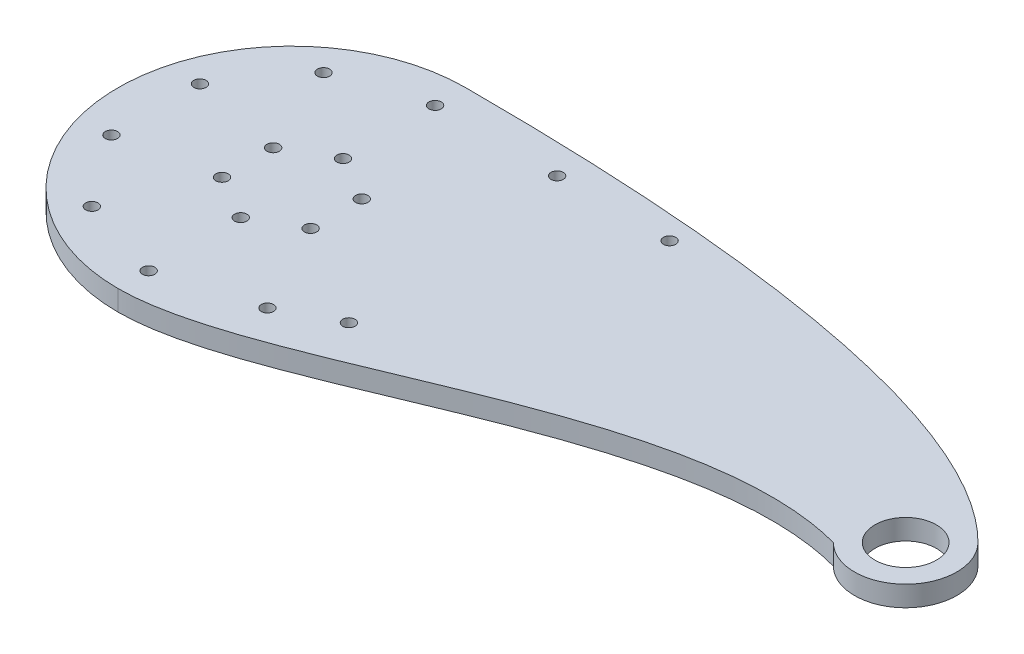
ISO-10303-21;
HEADER;
FILE_DESCRIPTION(('STEP AP214'),'2;1');
FILE_NAME('part.step','',(''),(''),'','','');
FILE_SCHEMA(('AUTOMOTIVE_DESIGN { 1 0 10303 214 1 1 1 1 }'));
ENDSEC;
DATA;
#1=APPLICATION_CONTEXT('core data for automotive mechanical design processes');
#2=APPLICATION_PROTOCOL_DEFINITION('international standard','automotive_design',2000,#1);
#3=PRODUCT_CONTEXT('',#1,'mechanical');
#4=PRODUCT('Part','Part','',(#3));
#5=PRODUCT_RELATED_PRODUCT_CATEGORY('part','',(#4));
#6=PRODUCT_DEFINITION_FORMATION('','',#4);
#7=PRODUCT_DEFINITION_CONTEXT('part definition',#1,'design');
#8=PRODUCT_DEFINITION('design','',#6,#7);
#9=PRODUCT_DEFINITION_SHAPE('','',#8);
#10=(LENGTH_UNIT() NAMED_UNIT(*) SI_UNIT(.MILLI.,.METRE.));
#11=(NAMED_UNIT(*) PLANE_ANGLE_UNIT() SI_UNIT($,.RADIAN.));
#12=(NAMED_UNIT(*) SI_UNIT($,.STERADIAN.) SOLID_ANGLE_UNIT());
#13=UNCERTAINTY_MEASURE_WITH_UNIT(LENGTH_MEASURE(1.E-05),#10,'distance_accuracy_value','');
#14=(GEOMETRIC_REPRESENTATION_CONTEXT(3) GLOBAL_UNCERTAINTY_ASSIGNED_CONTEXT((#13)) GLOBAL_UNIT_ASSIGNED_CONTEXT((#10,
#11,#12)) REPRESENTATION_CONTEXT('',''));
#15=CARTESIAN_POINT('',(0.,0.,0.));
#16=DIRECTION('',(0.,0.,1.));
#17=DIRECTION('',(1.,0.,0.));
#18=AXIS2_PLACEMENT_3D('',#15,#16,#17);
#19=CARTESIAN_POINT('',(0.,5.,0.));
#20=DIRECTION('',(0.,-1.,0.));
#21=DIRECTION('',(0.,0.,-1.));
#22=AXIS2_PLACEMENT_3D('',#19,#20,#21);
#23=CYLINDRICAL_SURFACE('',#22,42.5);
#24=CARTESIAN_POINT('',(0.,0.,0.));
#25=DIRECTION('',(0.,1.,0.));
#26=DIRECTION('',(0.,0.,1.));
#27=AXIS2_PLACEMENT_3D('',#24,#25,#26);
#28=CIRCLE('',#27,42.5);
#29=CARTESIAN_POINT('',(0.,0.,-42.5));
#30=VERTEX_POINT('',#29);
#31=CARTESIAN_POINT('',(0.,0.,42.5));
#32=VERTEX_POINT('',#31);
#33=EDGE_CURVE('E129',#30,#32,#28,.T.);
#34=ORIENTED_EDGE('',*,*,#33,.T.);
#35=DIRECTION('',(0.,-1.,0.));
#36=VECTOR('',#35,1.);
#37=CARTESIAN_POINT('',(0.,5.,42.5));
#38=LINE('',#37,#36);
#39=CARTESIAN_POINT('',(0.,5.,42.5));
#40=VERTEX_POINT('',#39);
#41=EDGE_CURVE('E11',#40,#32,#38,.T.);
#42=ORIENTED_EDGE('',*,*,#41,.F.);
#43=CARTESIAN_POINT('',(0.,5.,0.));
#44=DIRECTION('',(0.,1.,0.));
#45=DIRECTION('',(0.,0.,1.));
#46=AXIS2_PLACEMENT_3D('',#43,#44,#45);
#47=CIRCLE('',#46,42.5);
#48=CARTESIAN_POINT('',(0.,5.,-42.5));
#49=VERTEX_POINT('',#48);
#50=EDGE_CURVE('E89',#49,#40,#47,.T.);
#51=ORIENTED_EDGE('',*,*,#50,.F.);
#52=DIRECTION('',(0.,-1.,0.));
#53=VECTOR('',#52,1.);
#54=CARTESIAN_POINT('',(0.,5.,-42.5));
#55=LINE('',#54,#53);
#56=EDGE_CURVE('E55',#49,#30,#55,.T.);
#57=ORIENTED_EDGE('',*,*,#56,.T.);
#58=EDGE_LOOP('',(#34,#42,#51,#57));
#59=FACE_BOUND('',#58,.T.);
#60=ADVANCED_FACE('F37',(#59),#23,.T.);
#61=CARTESIAN_POINT('',(0.,5.,42.5));
#62=CARTESIAN_POINT('',(35.2879098348382,5.,42.5));
#63=CARTESIAN_POINT('',(94.2965735894884,5.,-3.71849472024249));
#64=CARTESIAN_POINT('',(141.161165235168,5.,8.83883476483181));
#65=B_SPLINE_CURVE_WITH_KNOTS('',3,(#61,#62,#63,#64),.UNSPECIFIED.,.F.,.F.,(4,4),(0.,1.),.UNSPECIFIED.);
#66=DIRECTION('',(0.,-1.,0.));
#67=VECTOR('',#66,1.);
#68=SURFACE_OF_LINEAR_EXTRUSION('',#65,#67);
#69=CARTESIAN_POINT('',(0.,0.,42.5));
#70=CARTESIAN_POINT('',(35.2879098348382,0.,42.5));
#71=CARTESIAN_POINT('',(94.2965735894884,0.,-3.71849472024249));
#72=CARTESIAN_POINT('',(141.161165235168,0.,8.83883476483181));
#73=B_SPLINE_CURVE_WITH_KNOTS('',3,(#69,#70,#71,#72),.UNSPECIFIED.,.F.,.F.,(4,4),(0.,1.),.UNSPECIFIED.);
#74=CARTESIAN_POINT('',(141.161165235168,0.,8.83883476483184));
#75=VERTEX_POINT('',#74);
#76=EDGE_CURVE('E94',#32,#75,#73,.T.);
#77=ORIENTED_EDGE('',*,*,#76,.T.);
#78=DIRECTION('',(0.,-1.,0.));
#79=VECTOR('',#78,1.);
#80=CARTESIAN_POINT('',(141.161165235168,5.,8.83883476483184));
#81=LINE('',#80,#79);
#82=CARTESIAN_POINT('',(141.161165235168,5.,8.83883476483184));
#83=VERTEX_POINT('',#82);
#84=EDGE_CURVE('E46',#83,#75,#81,.T.);
#85=ORIENTED_EDGE('',*,*,#84,.F.);
#86=EDGE_CURVE('E81',#40,#83,#65,.T.);
#87=ORIENTED_EDGE('',*,*,#86,.F.);
#88=ORIENTED_EDGE('',*,*,#41,.T.);
#89=EDGE_LOOP('',(#77,#85,#87,#88));
#90=FACE_BOUND('',#89,.T.);
#91=ADVANCED_FACE('F93',(#90),#68,.F.);
#92=CARTESIAN_POINT('',(150.,5.,0.));
#93=DIRECTION('',(0.,-1.,0.));
#94=DIRECTION('',(0.,0.,-1.));
#95=AXIS2_PLACEMENT_3D('',#92,#93,#94);
#96=CYLINDRICAL_SURFACE('',#95,12.5);
#97=CARTESIAN_POINT('',(150.,0.,0.));
#98=DIRECTION('',(0.,1.,0.));
#99=DIRECTION('',(0.,0.,1.));
#100=AXIS2_PLACEMENT_3D('',#97,#98,#99);
#101=CIRCLE('',#100,12.5);
#102=CARTESIAN_POINT('',(158.838834764832,0.,-8.83883476483186));
#103=VERTEX_POINT('',#102);
#104=EDGE_CURVE('E133',#75,#103,#101,.T.);
#105=ORIENTED_EDGE('',*,*,#104,.T.);
#106=DIRECTION('',(0.,-1.,0.));
#107=VECTOR('',#106,1.);
#108=CARTESIAN_POINT('',(158.838834764832,5.,-8.83883476483186));
#109=LINE('',#108,#107);
#110=CARTESIAN_POINT('',(158.838834764832,5.,-8.83883476483186));
#111=VERTEX_POINT('',#110);
#112=EDGE_CURVE('E70',#111,#103,#109,.T.);
#113=ORIENTED_EDGE('',*,*,#112,.F.);
#114=CARTESIAN_POINT('',(150.,5.,0.));
#115=DIRECTION('',(0.,1.,0.));
#116=DIRECTION('',(0.,0.,1.));
#117=AXIS2_PLACEMENT_3D('',#114,#115,#116);
#118=CIRCLE('',#117,12.5);
#119=EDGE_CURVE('E88',#83,#111,#118,.T.);
#120=ORIENTED_EDGE('',*,*,#119,.F.);
#121=ORIENTED_EDGE('',*,*,#84,.T.);
#122=EDGE_LOOP('',(#105,#113,#120,#121));
#123=FACE_BOUND('',#122,.T.);
#124=ADVANCED_FACE('F98',(#123),#96,.T.);
#125=CARTESIAN_POINT('',(0.,5.,-42.5));
#126=CARTESIAN_POINT('',(43.8603574156955,5.,-42.5000000000001));
#127=CARTESIAN_POINT('',(128.226009793748,5.,-39.4516597359159));
#128=CARTESIAN_POINT('',(158.838834764832,5.,-8.83883476483186));
#129=B_SPLINE_CURVE_WITH_KNOTS('',3,(#125,#126,#127,#128),.UNSPECIFIED.,.F.,.F.,(4,4),(0.,1.),.UNSPECIFIED.);
#130=DIRECTION('',(0.,-1.,0.));
#131=VECTOR('',#130,1.);
#132=SURFACE_OF_LINEAR_EXTRUSION('',#129,#131);
#133=CARTESIAN_POINT('',(0.,0.,-42.5));
#134=CARTESIAN_POINT('',(43.8603574156955,0.,-42.5000000000001));
#135=CARTESIAN_POINT('',(128.226009793748,0.,-39.4516597359159));
#136=CARTESIAN_POINT('',(158.838834764832,0.,-8.83883476483186));
#137=B_SPLINE_CURVE_WITH_KNOTS('',3,(#133,#134,#135,#136),.UNSPECIFIED.,.F.,.F.,(4,4),(0.,1.),.UNSPECIFIED.);
#138=EDGE_CURVE('E145',#30,#103,#137,.T.);
#139=ORIENTED_EDGE('',*,*,#138,.F.);
#140=ORIENTED_EDGE('',*,*,#56,.F.);
#141=EDGE_CURVE('E99',#49,#111,#129,.T.);
#142=ORIENTED_EDGE('',*,*,#141,.T.);
#143=ORIENTED_EDGE('',*,*,#112,.T.);
#144=EDGE_LOOP('',(#139,#140,#142,#143));
#145=FACE_BOUND('',#144,.T.);
#146=ADVANCED_FACE('F116',(#145),#132,.T.);
#147=CARTESIAN_POINT('',(150.,5.,0.));
#148=DIRECTION('',(0.,-1.,0.));
#149=DIRECTION('',(0.,0.,-1.));
#150=AXIS2_PLACEMENT_3D('',#147,#148,#149);
#151=CYLINDRICAL_SURFACE('',#150,7.50000000000001);
#152=CARTESIAN_POINT('',(150.,5.,0.));
#153=DIRECTION('',(0.,1.,0.));
#154=DIRECTION('',(0.,0.,1.));
#155=AXIS2_PLACEMENT_3D('',#152,#153,#154);
#156=CIRCLE('',#155,7.50000000000001);
#157=CARTESIAN_POINT('',(150.,5.,7.50000000000001));
#158=VERTEX_POINT('',#157);
#159=EDGE_CURVE('E101',#158,#158,#156,.T.);
#160=ORIENTED_EDGE('',*,*,#159,.T.);
#161=EDGE_LOOP('',(#160));
#162=FACE_BOUND('',#161,.T.);
#163=CARTESIAN_POINT('',(150.,0.,0.));
#164=DIRECTION('',(0.,1.,0.));
#165=DIRECTION('',(0.,0.,1.));
#166=AXIS2_PLACEMENT_3D('',#163,#164,#165);
#167=CIRCLE('',#166,7.50000000000001);
#168=CARTESIAN_POINT('',(150.,0.,7.50000000000001));
#169=VERTEX_POINT('',#168);
#170=EDGE_CURVE('E149',#169,#169,#167,.T.);
#171=ORIENTED_EDGE('',*,*,#170,.F.);
#172=EDGE_LOOP('',(#171));
#173=FACE_BOUND('',#172,.T.);
#174=ADVANCED_FACE('F120',(#162,#173),#151,.F.);
#175=CARTESIAN_POINT('',(0.,5.,0.));
#176=DIRECTION('',(0.,1.,0.));
#177=DIRECTION('',(0.,0.,1.));
#178=AXIS2_PLACEMENT_3D('',#175,#176,#177);
#179=PLANE('',#178);
#180=CARTESIAN_POINT('',(35.461413578459,5.,21.5303491163372));
#181=DIRECTION('',(0.,1.,0.));
#182=DIRECTION('',(0.,0.,1.));
#183=AXIS2_PLACEMENT_3D('',#180,#181,#182);
#184=CIRCLE('',#183,1.5);
#185=CARTESIAN_POINT('',(35.461413578459,5.,23.0303491163372));
#186=VERTEX_POINT('',#185);
#187=EDGE_CURVE('E199',#186,#186,#184,.T.);
#188=ORIENTED_EDGE('',*,*,#187,.F.);
#189=EDGE_LOOP('',(#188));
#190=FACE_BOUND('',#189,.T.);
#191=CARTESIAN_POINT('',(22.3920433471983,5.,28.360493420162));
#192=DIRECTION('',(0.,1.,0.));
#193=DIRECTION('',(0.,0.,1.));
#194=AXIS2_PLACEMENT_3D('',#191,#192,#193);
#195=CIRCLE('',#194,1.5);
#196=CARTESIAN_POINT('',(22.3920433471983,5.,29.860493420162));
#197=VERTEX_POINT('',#196);
#198=EDGE_CURVE('E205',#197,#197,#195,.T.);
#199=ORIENTED_EDGE('',*,*,#198,.F.);
#200=EDGE_LOOP('',(#199));
#201=FACE_BOUND('',#200,.T.);
#202=CARTESIAN_POINT('',(29.8225083043157,5.,-35.));
#203=DIRECTION('',(0.,1.,0.));
#204=DIRECTION('',(0.,0.,1.));
#205=AXIS2_PLACEMENT_3D('',#202,#203,#204);
#206=CIRCLE('',#205,1.5);
#207=CARTESIAN_POINT('',(29.8225083043157,5.,-33.5));
#208=VERTEX_POINT('',#207);
#209=EDGE_CURVE('E194',#208,#208,#206,.T.);
#210=ORIENTED_EDGE('',*,*,#209,.F.);
#211=EDGE_LOOP('',(#210));
#212=FACE_BOUND('',#211,.T.);
#213=CARTESIAN_POINT('',(57.3129098871164,5.,-35.));
#214=DIRECTION('',(0.,1.,0.));
#215=DIRECTION('',(0.,0.,1.));
#216=AXIS2_PLACEMENT_3D('',#213,#214,#215);
#217=CIRCLE('',#216,1.5);
#218=CARTESIAN_POINT('',(57.3129098871164,5.,-33.5));
#219=VERTEX_POINT('',#218);
#220=EDGE_CURVE('E203',#219,#219,#217,.T.);
#221=ORIENTED_EDGE('',*,*,#220,.F.);
#222=EDGE_LOOP('',(#221));
#223=FACE_BOUND('',#222,.T.);
#224=CARTESIAN_POINT('',(0.,5.,-35.));
#225=DIRECTION('',(0.,1.,0.));
#226=DIRECTION('',(0.,0.,1.));
#227=AXIS2_PLACEMENT_3D('',#224,#225,#226);
#228=CIRCLE('',#227,1.5);
#229=CARTESIAN_POINT('',(0.,5.,-33.5));
#230=VERTEX_POINT('',#229);
#231=EDGE_CURVE('E161',#230,#230,#228,.T.);
#232=ORIENTED_EDGE('',*,*,#231,.F.);
#233=EDGE_LOOP('',(#232));
#234=FACE_BOUND('',#233,.T.);
#235=CARTESIAN_POINT('',(2.27895078803825E-12,5.,35.));
#236=DIRECTION('',(0.,1.,0.));
#237=DIRECTION('',(0.,0.,1.));
#238=AXIS2_PLACEMENT_3D('',#235,#236,#237);
#239=CIRCLE('',#238,1.50000000000195);
#240=CARTESIAN_POINT('',(2.27895078803825E-12,5.,36.5000000000019));
#241=VERTEX_POINT('',#240);
#242=EDGE_CURVE('E196',#241,#241,#239,.T.);
#243=ORIENTED_EDGE('',*,*,#242,.F.);
#244=EDGE_LOOP('',(#243));
#245=FACE_BOUND('',#244,.T.);
#246=CARTESIAN_POINT('',(-20.5724838302341,5.,28.3155948031235));
#247=DIRECTION('',(0.,1.,0.));
#248=DIRECTION('',(0.,0.,1.));
#249=AXIS2_PLACEMENT_3D('',#246,#247,#248);
#250=CIRCLE('',#249,1.50000000000231);
#251=CARTESIAN_POINT('',(-20.5724838302341,5.,29.8155948031258));
#252=VERTEX_POINT('',#251);
#253=EDGE_CURVE('E223',#252,#252,#250,.T.);
#254=ORIENTED_EDGE('',*,*,#253,.F.);
#255=EDGE_LOOP('',(#254));
#256=FACE_BOUND('',#255,.T.);
#257=CARTESIAN_POINT('',(-33.2869780703281,5.,10.8155948031241));
#258=DIRECTION('',(0.,1.,0.));
#259=DIRECTION('',(0.,0.,1.));
#260=AXIS2_PLACEMENT_3D('',#257,#258,#259);
#261=CIRCLE('',#260,1.50000000000193);
#262=CARTESIAN_POINT('',(-33.2869780703281,5.,12.315594803126));
#263=VERTEX_POINT('',#262);
#264=EDGE_CURVE('E219',#263,#263,#261,.T.);
#265=ORIENTED_EDGE('',*,*,#264,.F.);
#266=EDGE_LOOP('',(#265));
#267=FACE_BOUND('',#266,.T.);
#268=CARTESIAN_POINT('',(-33.2869780703288,5.,-10.8155948031219));
#269=DIRECTION('',(0.,1.,0.));
#270=DIRECTION('',(0.,0.,1.));
#271=AXIS2_PLACEMENT_3D('',#268,#269,#270);
#272=CIRCLE('',#271,1.50000000000113);
#273=CARTESIAN_POINT('',(-33.2869780703288,5.,-9.31559480312079));
#274=VERTEX_POINT('',#273);
#275=EDGE_CURVE('E222',#274,#274,#272,.T.);
#276=ORIENTED_EDGE('',*,*,#275,.F.);
#277=EDGE_LOOP('',(#276));
#278=FACE_BOUND('',#277,.T.);
#279=CARTESIAN_POINT('',(-20.5724838302359,5.,-28.3155948031222));
#280=DIRECTION('',(0.,1.,0.));
#281=DIRECTION('',(0.,0.,1.));
#282=AXIS2_PLACEMENT_3D('',#279,#280,#281);
#283=CIRCLE('',#282,1.50000000000035);
#284=CARTESIAN_POINT('',(-20.5724838302359,5.,-26.8155948031219));
#285=VERTEX_POINT('',#284);
#286=EDGE_CURVE('E245',#285,#285,#283,.T.);
#287=ORIENTED_EDGE('',*,*,#286,.F.);
#288=EDGE_LOOP('',(#287));
#289=FACE_BOUND('',#288,.T.);
#290=CARTESIAN_POINT('',(-10.825317547305,5.,-6.24999999999907));
#291=DIRECTION('',(0.,1.,0.));
#292=DIRECTION('',(0.,0.,1.));
#293=AXIS2_PLACEMENT_3D('',#290,#291,#292);
#294=CIRCLE('',#293,1.50000000000142);
#295=CARTESIAN_POINT('',(-10.825317547305,5.,-4.74999999999766));
#296=VERTEX_POINT('',#295);
#297=EDGE_CURVE('E242',#296,#296,#294,.T.);
#298=ORIENTED_EDGE('',*,*,#297,.F.);
#299=EDGE_LOOP('',(#298));
#300=FACE_BOUND('',#299,.T.);
#301=CARTESIAN_POINT('',(-10.8253175473039,5.,6.25000000000092));
#302=DIRECTION('',(0.,1.,0.));
#303=DIRECTION('',(0.,0.,1.));
#304=AXIS2_PLACEMENT_3D('',#301,#302,#303);
#305=CIRCLE('',#304,1.50000000000103);
#306=CARTESIAN_POINT('',(-10.8253175473039,5.,7.75000000000196));
#307=VERTEX_POINT('',#306);
#308=EDGE_CURVE('E239',#307,#307,#305,.T.);
#309=ORIENTED_EDGE('',*,*,#308,.F.);
#310=EDGE_LOOP('',(#309));
#311=FACE_BOUND('',#310,.T.);
#312=CARTESIAN_POINT('',(2.12091254778776E-12,5.,12.5));
#313=DIRECTION('',(0.,1.,0.));
#314=DIRECTION('',(0.,0.,1.));
#315=AXIS2_PLACEMENT_3D('',#312,#313,#314);
#316=CIRCLE('',#315,1.50000000000063);
#317=CARTESIAN_POINT('',(2.12091254778776E-12,5.,14.0000000000006));
#318=VERTEX_POINT('',#317);
#319=EDGE_CURVE('E236',#318,#318,#316,.T.);
#320=ORIENTED_EDGE('',*,*,#319,.F.);
#321=EDGE_LOOP('',(#320));
#322=FACE_BOUND('',#321,.T.);
#323=CARTESIAN_POINT('',(10.8253175473071,5.,6.24999999999908));
#324=DIRECTION('',(0.,1.,0.));
#325=DIRECTION('',(0.,0.,1.));
#326=AXIS2_PLACEMENT_3D('',#323,#324,#325);
#327=CIRCLE('',#326,1.50000000000029);
#328=CARTESIAN_POINT('',(10.8253175473071,5.,7.74999999999937));
#329=VERTEX_POINT('',#328);
#330=EDGE_CURVE('E233',#329,#329,#327,.T.);
#331=ORIENTED_EDGE('',*,*,#330,.F.);
#332=EDGE_LOOP('',(#331));
#333=FACE_BOUND('',#332,.T.);
#334=CARTESIAN_POINT('',(10.825317547306,5.,-6.25000000000021));
#335=DIRECTION('',(0.,1.,0.));
#336=DIRECTION('',(0.,0.,1.));
#337=AXIS2_PLACEMENT_3D('',#334,#335,#336);
#338=CIRCLE('',#337,1.5);
#339=CARTESIAN_POINT('',(10.825317547306,5.,-4.75000000000021));
#340=VERTEX_POINT('',#339);
#341=EDGE_CURVE('E230',#340,#340,#338,.T.);
#342=ORIENTED_EDGE('',*,*,#341,.F.);
#343=EDGE_LOOP('',(#342));
#344=FACE_BOUND('',#343,.T.);
#345=CARTESIAN_POINT('',(0.,5.,-12.5));
#346=DIRECTION('',(0.,1.,0.));
#347=DIRECTION('',(0.,0.,1.));
#348=AXIS2_PLACEMENT_3D('',#345,#346,#347);
#349=CIRCLE('',#348,1.5);
#350=CARTESIAN_POINT('',(0.,5.,-11.));
#351=VERTEX_POINT('',#350);
#352=EDGE_CURVE('E218',#351,#351,#349,.T.);
#353=ORIENTED_EDGE('',*,*,#352,.F.);
#354=EDGE_LOOP('',(#353));
#355=FACE_BOUND('',#354,.T.);
#356=ORIENTED_EDGE('',*,*,#50,.T.);
#357=ORIENTED_EDGE('',*,*,#86,.T.);
#358=ORIENTED_EDGE('',*,*,#119,.T.);
#359=ORIENTED_EDGE('',*,*,#141,.F.);
#360=EDGE_LOOP('',(#356,#357,#358,#359));
#361=FACE_BOUND('',#360,.T.);
#362=ORIENTED_EDGE('',*,*,#159,.F.);
#363=EDGE_LOOP('',(#362));
#364=FACE_BOUND('',#363,.T.);
#365=ADVANCED_FACE('F84',(#190,#201,#212,#223,#234,#245,#256,#267,#278,#289,#300,#311,#322,#333,
#344,#355,#361,#364),#179,.T.);
#366=CARTESIAN_POINT('',(0.,0.,0.));
#367=DIRECTION('',(0.,1.,0.));
#368=DIRECTION('',(0.,0.,1.));
#369=AXIS2_PLACEMENT_3D('',#366,#367,#368);
#370=PLANE('',#369);
#371=CARTESIAN_POINT('',(35.461413578459,0.,21.5303491163372));
#372=DIRECTION('',(0.,1.,0.));
#373=DIRECTION('',(0.,0.,1.));
#374=AXIS2_PLACEMENT_3D('',#371,#372,#373);
#375=CIRCLE('',#374,1.5);
#376=CARTESIAN_POINT('',(35.461413578459,0.,23.0303491163372));
#377=VERTEX_POINT('',#376);
#378=EDGE_CURVE('E40',#377,#377,#375,.T.);
#379=ORIENTED_EDGE('',*,*,#378,.T.);
#380=EDGE_LOOP('',(#379));
#381=FACE_BOUND('',#380,.T.);
#382=CARTESIAN_POINT('',(22.3920433471983,0.,28.360493420162));
#383=DIRECTION('',(0.,1.,0.));
#384=DIRECTION('',(0.,0.,1.));
#385=AXIS2_PLACEMENT_3D('',#382,#383,#384);
#386=CIRCLE('',#385,1.5);
#387=CARTESIAN_POINT('',(22.3920433471983,0.,29.860493420162));
#388=VERTEX_POINT('',#387);
#389=EDGE_CURVE('E197',#388,#388,#386,.T.);
#390=ORIENTED_EDGE('',*,*,#389,.T.);
#391=EDGE_LOOP('',(#390));
#392=FACE_BOUND('',#391,.T.);
#393=CARTESIAN_POINT('',(29.8225083043157,0.,-35.));
#394=DIRECTION('',(0.,1.,0.));
#395=DIRECTION('',(0.,0.,1.));
#396=AXIS2_PLACEMENT_3D('',#393,#394,#395);
#397=CIRCLE('',#396,1.5);
#398=CARTESIAN_POINT('',(29.8225083043157,0.,-33.5));
#399=VERTEX_POINT('',#398);
#400=EDGE_CURVE('E193',#399,#399,#397,.T.);
#401=ORIENTED_EDGE('',*,*,#400,.T.);
#402=EDGE_LOOP('',(#401));
#403=FACE_BOUND('',#402,.T.);
#404=CARTESIAN_POINT('',(57.3129098871164,0.,-35.));
#405=DIRECTION('',(0.,1.,0.));
#406=DIRECTION('',(0.,0.,1.));
#407=AXIS2_PLACEMENT_3D('',#404,#405,#406);
#408=CIRCLE('',#407,1.5);
#409=CARTESIAN_POINT('',(57.3129098871164,0.,-33.5));
#410=VERTEX_POINT('',#409);
#411=EDGE_CURVE('E190',#410,#410,#408,.T.);
#412=ORIENTED_EDGE('',*,*,#411,.T.);
#413=EDGE_LOOP('',(#412));
#414=FACE_BOUND('',#413,.T.);
#415=CARTESIAN_POINT('',(0.,0.,-35.));
#416=DIRECTION('',(0.,1.,0.));
#417=DIRECTION('',(0.,0.,1.));
#418=AXIS2_PLACEMENT_3D('',#415,#416,#417);
#419=CIRCLE('',#418,1.5);
#420=CARTESIAN_POINT('',(0.,0.,-33.5));
#421=VERTEX_POINT('',#420);
#422=EDGE_CURVE('E132',#421,#421,#419,.T.);
#423=ORIENTED_EDGE('',*,*,#422,.T.);
#424=EDGE_LOOP('',(#423));
#425=FACE_BOUND('',#424,.T.);
#426=CARTESIAN_POINT('',(2.27895078803825E-12,0.,35.));
#427=DIRECTION('',(0.,1.,0.));
#428=DIRECTION('',(0.,0.,1.));
#429=AXIS2_PLACEMENT_3D('',#426,#427,#428);
#430=CIRCLE('',#429,1.50000000000195);
#431=CARTESIAN_POINT('',(2.27895078803825E-12,0.,36.5000000000019));
#432=VERTEX_POINT('',#431);
#433=EDGE_CURVE('E136',#432,#432,#430,.T.);
#434=ORIENTED_EDGE('',*,*,#433,.T.);
#435=EDGE_LOOP('',(#434));
#436=FACE_BOUND('',#435,.T.);
#437=CARTESIAN_POINT('',(-20.5724838302341,0.,28.3155948031235));
#438=DIRECTION('',(0.,1.,0.));
#439=DIRECTION('',(0.,0.,1.));
#440=AXIS2_PLACEMENT_3D('',#437,#438,#439);
#441=CIRCLE('',#440,1.50000000000231);
#442=CARTESIAN_POINT('',(-20.5724838302341,0.,29.8155948031258));
#443=VERTEX_POINT('',#442);
#444=EDGE_CURVE('E185',#443,#443,#441,.T.);
#445=ORIENTED_EDGE('',*,*,#444,.T.);
#446=EDGE_LOOP('',(#445));
#447=FACE_BOUND('',#446,.T.);
#448=CARTESIAN_POINT('',(-33.2869780703281,0.,10.8155948031241));
#449=DIRECTION('',(0.,1.,0.));
#450=DIRECTION('',(0.,0.,1.));
#451=AXIS2_PLACEMENT_3D('',#448,#449,#450);
#452=CIRCLE('',#451,1.50000000000193);
#453=CARTESIAN_POINT('',(-33.2869780703281,0.,12.315594803126));
#454=VERTEX_POINT('',#453);
#455=EDGE_CURVE('E182',#454,#454,#452,.T.);
#456=ORIENTED_EDGE('',*,*,#455,.T.);
#457=EDGE_LOOP('',(#456));
#458=FACE_BOUND('',#457,.T.);
#459=CARTESIAN_POINT('',(-33.2869780703288,0.,-10.8155948031219));
#460=DIRECTION('',(0.,1.,0.));
#461=DIRECTION('',(0.,0.,1.));
#462=AXIS2_PLACEMENT_3D('',#459,#460,#461);
#463=CIRCLE('',#462,1.50000000000113);
#464=CARTESIAN_POINT('',(-33.2869780703288,0.,-9.31559480312079));
#465=VERTEX_POINT('',#464);
#466=EDGE_CURVE('E179',#465,#465,#463,.T.);
#467=ORIENTED_EDGE('',*,*,#466,.T.);
#468=EDGE_LOOP('',(#467));
#469=FACE_BOUND('',#468,.T.);
#470=CARTESIAN_POINT('',(-20.5724838302359,0.,-28.3155948031222));
#471=DIRECTION('',(0.,1.,0.));
#472=DIRECTION('',(0.,0.,1.));
#473=AXIS2_PLACEMENT_3D('',#470,#471,#472);
#474=CIRCLE('',#473,1.50000000000035);
#475=CARTESIAN_POINT('',(-20.5724838302359,0.,-26.8155948031219));
#476=VERTEX_POINT('',#475);
#477=EDGE_CURVE('E176',#476,#476,#474,.T.);
#478=ORIENTED_EDGE('',*,*,#477,.T.);
#479=EDGE_LOOP('',(#478));
#480=FACE_BOUND('',#479,.T.);
#481=CARTESIAN_POINT('',(-10.825317547305,0.,-6.24999999999907));
#482=DIRECTION('',(0.,1.,0.));
#483=DIRECTION('',(0.,0.,1.));
#484=AXIS2_PLACEMENT_3D('',#481,#482,#483);
#485=CIRCLE('',#484,1.50000000000142);
#486=CARTESIAN_POINT('',(-10.825317547305,0.,-4.74999999999766));
#487=VERTEX_POINT('',#486);
#488=EDGE_CURVE('E173',#487,#487,#485,.T.);
#489=ORIENTED_EDGE('',*,*,#488,.T.);
#490=EDGE_LOOP('',(#489));
#491=FACE_BOUND('',#490,.T.);
#492=CARTESIAN_POINT('',(-10.8253175473039,0.,6.25000000000092));
#493=DIRECTION('',(0.,1.,0.));
#494=DIRECTION('',(0.,0.,1.));
#495=AXIS2_PLACEMENT_3D('',#492,#493,#494);
#496=CIRCLE('',#495,1.50000000000103);
#497=CARTESIAN_POINT('',(-10.8253175473039,0.,7.75000000000196));
#498=VERTEX_POINT('',#497);
#499=EDGE_CURVE('E170',#498,#498,#496,.T.);
#500=ORIENTED_EDGE('',*,*,#499,.T.);
#501=EDGE_LOOP('',(#500));
#502=FACE_BOUND('',#501,.T.);
#503=CARTESIAN_POINT('',(2.12091254778776E-12,0.,12.5));
#504=DIRECTION('',(0.,1.,0.));
#505=DIRECTION('',(0.,0.,1.));
#506=AXIS2_PLACEMENT_3D('',#503,#504,#505);
#507=CIRCLE('',#506,1.50000000000063);
#508=CARTESIAN_POINT('',(2.12091254778776E-12,0.,14.0000000000006));
#509=VERTEX_POINT('',#508);
#510=EDGE_CURVE('E167',#509,#509,#507,.T.);
#511=ORIENTED_EDGE('',*,*,#510,.T.);
#512=EDGE_LOOP('',(#511));
#513=FACE_BOUND('',#512,.T.);
#514=CARTESIAN_POINT('',(10.8253175473071,0.,6.24999999999908));
#515=DIRECTION('',(0.,1.,0.));
#516=DIRECTION('',(0.,0.,1.));
#517=AXIS2_PLACEMENT_3D('',#514,#515,#516);
#518=CIRCLE('',#517,1.50000000000029);
#519=CARTESIAN_POINT('',(10.8253175473071,0.,7.74999999999937));
#520=VERTEX_POINT('',#519);
#521=EDGE_CURVE('E164',#520,#520,#518,.T.);
#522=ORIENTED_EDGE('',*,*,#521,.T.);
#523=EDGE_LOOP('',(#522));
#524=FACE_BOUND('',#523,.T.);
#525=CARTESIAN_POINT('',(10.825317547306,0.,-6.25000000000021));
#526=DIRECTION('',(0.,1.,0.));
#527=DIRECTION('',(0.,0.,1.));
#528=AXIS2_PLACEMENT_3D('',#525,#526,#527);
#529=CIRCLE('',#528,1.5);
#530=CARTESIAN_POINT('',(10.825317547306,0.,-4.75000000000021));
#531=VERTEX_POINT('',#530);
#532=EDGE_CURVE('E160',#531,#531,#529,.T.);
#533=ORIENTED_EDGE('',*,*,#532,.T.);
#534=EDGE_LOOP('',(#533));
#535=FACE_BOUND('',#534,.T.);
#536=CARTESIAN_POINT('',(0.,0.,-12.5));
#537=DIRECTION('',(0.,1.,0.));
#538=DIRECTION('',(0.,0.,1.));
#539=AXIS2_PLACEMENT_3D('',#536,#537,#538);
#540=CIRCLE('',#539,1.5);
#541=CARTESIAN_POINT('',(0.,0.,-11.));
#542=VERTEX_POINT('',#541);
#543=EDGE_CURVE('E157',#542,#542,#540,.T.);
#544=ORIENTED_EDGE('',*,*,#543,.T.);
#545=EDGE_LOOP('',(#544));
#546=FACE_BOUND('',#545,.T.);
#547=ORIENTED_EDGE('',*,*,#33,.F.);
#548=ORIENTED_EDGE('',*,*,#138,.T.);
#549=ORIENTED_EDGE('',*,*,#104,.F.);
#550=ORIENTED_EDGE('',*,*,#76,.F.);
#551=EDGE_LOOP('',(#547,#548,#549,#550));
#552=FACE_BOUND('',#551,.T.);
#553=ORIENTED_EDGE('',*,*,#170,.T.);
#554=EDGE_LOOP('',(#553));
#555=FACE_BOUND('',#554,.T.);
#556=ADVANCED_FACE('F256',(#381,#392,#403,#414,#425,#436,#447,#458,#469,#480,#491,#502,#513,
#524,#535,#546,#552,#555),#370,.F.);
#557=CARTESIAN_POINT('',(0.,-5.,-12.5));
#558=DIRECTION('',(0.,1.,0.));
#559=DIRECTION('',(0.,0.,1.));
#560=AXIS2_PLACEMENT_3D('',#557,#558,#559);
#561=CYLINDRICAL_SURFACE('',#560,1.5);
#562=ORIENTED_EDGE('',*,*,#352,.T.);
#563=EDGE_LOOP('',(#562));
#564=FACE_BOUND('',#563,.T.);
#565=ORIENTED_EDGE('',*,*,#543,.F.);
#566=EDGE_LOOP('',(#565));
#567=FACE_BOUND('',#566,.T.);
#568=ADVANCED_FACE('F273',(#564,#567),#561,.F.);
#569=CARTESIAN_POINT('',(10.825317547306,-5.,-6.25000000000021));
#570=DIRECTION('',(0.,1.,0.));
#571=DIRECTION('',(0.,0.,1.));
#572=AXIS2_PLACEMENT_3D('',#569,#570,#571);
#573=CYLINDRICAL_SURFACE('',#572,1.5);
#574=ORIENTED_EDGE('',*,*,#341,.T.);
#575=EDGE_LOOP('',(#574));
#576=FACE_BOUND('',#575,.T.);
#577=ORIENTED_EDGE('',*,*,#532,.F.);
#578=EDGE_LOOP('',(#577));
#579=FACE_BOUND('',#578,.T.);
#580=ADVANCED_FACE('F276',(#576,#579),#573,.F.);
#581=CARTESIAN_POINT('',(10.8253175473071,-5.,6.24999999999908));
#582=DIRECTION('',(0.,1.,0.));
#583=DIRECTION('',(0.,0.,1.));
#584=AXIS2_PLACEMENT_3D('',#581,#582,#583);
#585=CYLINDRICAL_SURFACE('',#584,1.50000000000029);
#586=ORIENTED_EDGE('',*,*,#330,.T.);
#587=EDGE_LOOP('',(#586));
#588=FACE_BOUND('',#587,.T.);
#589=ORIENTED_EDGE('',*,*,#521,.F.);
#590=EDGE_LOOP('',(#589));
#591=FACE_BOUND('',#590,.T.);
#592=ADVANCED_FACE('F313',(#588,#591),#585,.F.);
#593=CARTESIAN_POINT('',(2.12091254778776E-12,-5.,12.5));
#594=DIRECTION('',(0.,1.,0.));
#595=DIRECTION('',(0.,0.,1.));
#596=AXIS2_PLACEMENT_3D('',#593,#594,#595);
#597=CYLINDRICAL_SURFACE('',#596,1.50000000000063);
#598=ORIENTED_EDGE('',*,*,#319,.T.);
#599=EDGE_LOOP('',(#598));
#600=FACE_BOUND('',#599,.T.);
#601=ORIENTED_EDGE('',*,*,#510,.F.);
#602=EDGE_LOOP('',(#601));
#603=FACE_BOUND('',#602,.T.);
#604=ADVANCED_FACE('F321',(#600,#603),#597,.F.);
#605=CARTESIAN_POINT('',(-10.8253175473039,-5.,6.25000000000092));
#606=DIRECTION('',(0.,1.,0.));
#607=DIRECTION('',(0.,0.,1.));
#608=AXIS2_PLACEMENT_3D('',#605,#606,#607);
#609=CYLINDRICAL_SURFACE('',#608,1.50000000000103);
#610=ORIENTED_EDGE('',*,*,#308,.T.);
#611=EDGE_LOOP('',(#610));
#612=FACE_BOUND('',#611,.T.);
#613=ORIENTED_EDGE('',*,*,#499,.F.);
#614=EDGE_LOOP('',(#613));
#615=FACE_BOUND('',#614,.T.);
#616=ADVANCED_FACE('F329',(#612,#615),#609,.F.);
#617=CARTESIAN_POINT('',(-10.825317547305,-5.,-6.24999999999907));
#618=DIRECTION('',(0.,1.,0.));
#619=DIRECTION('',(0.,0.,1.));
#620=AXIS2_PLACEMENT_3D('',#617,#618,#619);
#621=CYLINDRICAL_SURFACE('',#620,1.50000000000142);
#622=ORIENTED_EDGE('',*,*,#297,.T.);
#623=EDGE_LOOP('',(#622));
#624=FACE_BOUND('',#623,.T.);
#625=ORIENTED_EDGE('',*,*,#488,.F.);
#626=EDGE_LOOP('',(#625));
#627=FACE_BOUND('',#626,.T.);
#628=ADVANCED_FACE('F337',(#624,#627),#621,.F.);
#629=CARTESIAN_POINT('',(-20.5724838302359,-5.,-28.3155948031222));
#630=DIRECTION('',(0.,1.,0.));
#631=DIRECTION('',(0.,0.,1.));
#632=AXIS2_PLACEMENT_3D('',#629,#630,#631);
#633=CYLINDRICAL_SURFACE('',#632,1.50000000000035);
#634=ORIENTED_EDGE('',*,*,#286,.T.);
#635=EDGE_LOOP('',(#634));
#636=FACE_BOUND('',#635,.T.);
#637=ORIENTED_EDGE('',*,*,#477,.F.);
#638=EDGE_LOOP('',(#637));
#639=FACE_BOUND('',#638,.T.);
#640=ADVANCED_FACE('F345',(#636,#639),#633,.F.);
#641=CARTESIAN_POINT('',(-33.2869780703288,-5.,-10.8155948031219));
#642=DIRECTION('',(0.,1.,0.));
#643=DIRECTION('',(0.,0.,1.));
#644=AXIS2_PLACEMENT_3D('',#641,#642,#643);
#645=CYLINDRICAL_SURFACE('',#644,1.50000000000113);
#646=ORIENTED_EDGE('',*,*,#275,.T.);
#647=EDGE_LOOP('',(#646));
#648=FACE_BOUND('',#647,.T.);
#649=ORIENTED_EDGE('',*,*,#466,.F.);
#650=EDGE_LOOP('',(#649));
#651=FACE_BOUND('',#650,.T.);
#652=ADVANCED_FACE('F251',(#648,#651),#645,.F.);
#653=CARTESIAN_POINT('',(-33.2869780703281,-5.,10.8155948031241));
#654=DIRECTION('',(0.,1.,0.));
#655=DIRECTION('',(0.,0.,1.));
#656=AXIS2_PLACEMENT_3D('',#653,#654,#655);
#657=CYLINDRICAL_SURFACE('',#656,1.50000000000193);
#658=ORIENTED_EDGE('',*,*,#264,.T.);
#659=EDGE_LOOP('',(#658));
#660=FACE_BOUND('',#659,.T.);
#661=ORIENTED_EDGE('',*,*,#455,.F.);
#662=EDGE_LOOP('',(#661));
#663=FACE_BOUND('',#662,.T.);
#664=ADVANCED_FACE('F360',(#660,#663),#657,.F.);
#665=CARTESIAN_POINT('',(-20.5724838302341,-5.,28.3155948031235));
#666=DIRECTION('',(0.,1.,0.));
#667=DIRECTION('',(0.,0.,1.));
#668=AXIS2_PLACEMENT_3D('',#665,#666,#667);
#669=CYLINDRICAL_SURFACE('',#668,1.50000000000231);
#670=ORIENTED_EDGE('',*,*,#253,.T.);
#671=EDGE_LOOP('',(#670));
#672=FACE_BOUND('',#671,.T.);
#673=ORIENTED_EDGE('',*,*,#444,.F.);
#674=EDGE_LOOP('',(#673));
#675=FACE_BOUND('',#674,.T.);
#676=ADVANCED_FACE('F367',(#672,#675),#669,.F.);
#677=CARTESIAN_POINT('',(2.27895078803825E-12,-5.,35.));
#678=DIRECTION('',(0.,1.,0.));
#679=DIRECTION('',(0.,0.,1.));
#680=AXIS2_PLACEMENT_3D('',#677,#678,#679);
#681=CYLINDRICAL_SURFACE('',#680,1.50000000000195);
#682=ORIENTED_EDGE('',*,*,#242,.T.);
#683=EDGE_LOOP('',(#682));
#684=FACE_BOUND('',#683,.T.);
#685=ORIENTED_EDGE('',*,*,#433,.F.);
#686=EDGE_LOOP('',(#685));
#687=FACE_BOUND('',#686,.T.);
#688=ADVANCED_FACE('F375',(#684,#687),#681,.F.);
#689=CARTESIAN_POINT('',(0.,-5.,-35.));
#690=DIRECTION('',(0.,1.,0.));
#691=DIRECTION('',(0.,0.,1.));
#692=AXIS2_PLACEMENT_3D('',#689,#690,#691);
#693=CYLINDRICAL_SURFACE('',#692,1.5);
#694=ORIENTED_EDGE('',*,*,#231,.T.);
#695=EDGE_LOOP('',(#694));
#696=FACE_BOUND('',#695,.T.);
#697=ORIENTED_EDGE('',*,*,#422,.F.);
#698=EDGE_LOOP('',(#697));
#699=FACE_BOUND('',#698,.T.);
#700=ADVANCED_FACE('F383',(#696,#699),#693,.F.);
#701=CARTESIAN_POINT('',(57.3129098871164,-5.,-35.));
#702=DIRECTION('',(0.,1.,0.));
#703=DIRECTION('',(0.,0.,1.));
#704=AXIS2_PLACEMENT_3D('',#701,#702,#703);
#705=CYLINDRICAL_SURFACE('',#704,1.5);
#706=ORIENTED_EDGE('',*,*,#220,.T.);
#707=EDGE_LOOP('',(#706));
#708=FACE_BOUND('',#707,.T.);
#709=ORIENTED_EDGE('',*,*,#411,.F.);
#710=EDGE_LOOP('',(#709));
#711=FACE_BOUND('',#710,.T.);
#712=ADVANCED_FACE('F391',(#708,#711),#705,.F.);
#713=CARTESIAN_POINT('',(29.8225083043157,-5.,-35.));
#714=DIRECTION('',(0.,1.,0.));
#715=DIRECTION('',(0.,0.,1.));
#716=AXIS2_PLACEMENT_3D('',#713,#714,#715);
#717=CYLINDRICAL_SURFACE('',#716,1.5);
#718=ORIENTED_EDGE('',*,*,#209,.T.);
#719=EDGE_LOOP('',(#718));
#720=FACE_BOUND('',#719,.T.);
#721=ORIENTED_EDGE('',*,*,#400,.F.);
#722=EDGE_LOOP('',(#721));
#723=FACE_BOUND('',#722,.T.);
#724=ADVANCED_FACE('F399',(#720,#723),#717,.F.);
#725=CARTESIAN_POINT('',(22.3920433471983,-5.,28.360493420162));
#726=DIRECTION('',(0.,1.,0.));
#727=DIRECTION('',(0.,0.,1.));
#728=AXIS2_PLACEMENT_3D('',#725,#726,#727);
#729=CYLINDRICAL_SURFACE('',#728,1.5);
#730=ORIENTED_EDGE('',*,*,#198,.T.);
#731=EDGE_LOOP('',(#730));
#732=FACE_BOUND('',#731,.T.);
#733=ORIENTED_EDGE('',*,*,#389,.F.);
#734=EDGE_LOOP('',(#733));
#735=FACE_BOUND('',#734,.T.);
#736=ADVANCED_FACE('F406',(#732,#735),#729,.F.);
#737=CARTESIAN_POINT('',(35.461413578459,-5.,21.5303491163372));
#738=DIRECTION('',(0.,1.,0.));
#739=DIRECTION('',(0.,0.,1.));
#740=AXIS2_PLACEMENT_3D('',#737,#738,#739);
#741=CYLINDRICAL_SURFACE('',#740,1.5);
#742=ORIENTED_EDGE('',*,*,#187,.T.);
#743=EDGE_LOOP('',(#742));
#744=FACE_BOUND('',#743,.T.);
#745=ORIENTED_EDGE('',*,*,#378,.F.);
#746=EDGE_LOOP('',(#745));
#747=FACE_BOUND('',#746,.T.);
#748=ADVANCED_FACE('F413',(#744,#747),#741,.F.);
#749=CLOSED_SHELL('',(#60,#91,#124,#146,#174,#365,#556,#568,#580,#592,#604,#616,#628,#640,#652,
#664,#676,#688,#700,#712,#724,#736,#748));
#750=MANIFOLD_SOLID_BREP('B2',#749);
#751=ADVANCED_BREP_SHAPE_REPRESENTATION('',(#18,#750),#14);
#752=SHAPE_DEFINITION_REPRESENTATION(#9,#751);
ENDSEC;
END-ISO-10303-21;
